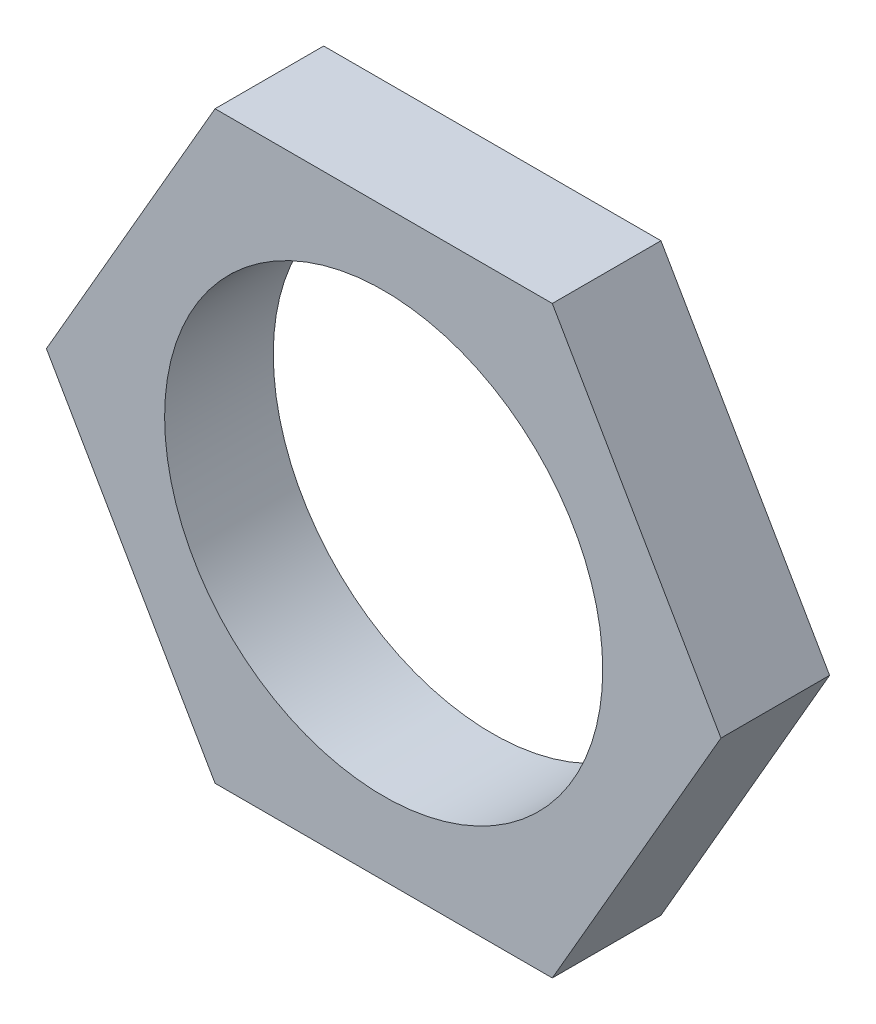
ISO-10303-21;
HEADER;
FILE_DESCRIPTION(('STEP AP214'),'2;1');
FILE_NAME('part.step','',(''),(''),'','','');
FILE_SCHEMA(('AUTOMOTIVE_DESIGN { 1 0 10303 214 1 1 1 1 }'));
ENDSEC;
DATA;
#1=APPLICATION_CONTEXT('core data for automotive mechanical design processes');
#2=APPLICATION_PROTOCOL_DEFINITION('international standard','automotive_design',2000,#1);
#3=PRODUCT_CONTEXT('',#1,'mechanical');
#4=PRODUCT('Part','Part','',(#3));
#5=PRODUCT_RELATED_PRODUCT_CATEGORY('part','',(#4));
#6=PRODUCT_DEFINITION_FORMATION('','',#4);
#7=PRODUCT_DEFINITION_CONTEXT('part definition',#1,'design');
#8=PRODUCT_DEFINITION('design','',#6,#7);
#9=PRODUCT_DEFINITION_SHAPE('','',#8);
#10=(LENGTH_UNIT() NAMED_UNIT(*) SI_UNIT(.MILLI.,.METRE.));
#11=(NAMED_UNIT(*) PLANE_ANGLE_UNIT() SI_UNIT($,.RADIAN.));
#12=(NAMED_UNIT(*) SI_UNIT($,.STERADIAN.) SOLID_ANGLE_UNIT());
#13=UNCERTAINTY_MEASURE_WITH_UNIT(LENGTH_MEASURE(1.E-05),#10,'distance_accuracy_value','');
#14=(GEOMETRIC_REPRESENTATION_CONTEXT(3) GLOBAL_UNCERTAINTY_ASSIGNED_CONTEXT((#13)) GLOBAL_UNIT_ASSIGNED_CONTEXT((#10,
#11,#12)) REPRESENTATION_CONTEXT('',''));
#15=CARTESIAN_POINT('',(0.,0.,0.));
#16=DIRECTION('',(0.,0.,1.));
#17=DIRECTION('',(1.,0.,0.));
#18=AXIS2_PLACEMENT_3D('',#15,#16,#17);
#19=CARTESIAN_POINT('',(-51.2087450524918,-9.71309050598041,2.3622));
#20=DIRECTION('',(0.,1.,0.));
#21=DIRECTION('',(-1.,0.,0.));
#22=AXIS2_PLACEMENT_3D('',#19,#20,#21);
#23=PLANE('',#22);
#24=DIRECTION('',(1.,0.,0.));
#25=VECTOR('',#24,1.);
#26=CARTESIAN_POINT('',(-51.2087450524918,-9.71309050598041,0.));
#27=LINE('',#26,#25);
#28=CARTESIAN_POINT('',(-58.5410934712003,-9.71309050598041,0.));
#29=VERTEX_POINT('',#28);
#30=CARTESIAN_POINT('',(-51.2087450524918,-9.71309050598041,0.));
#31=VERTEX_POINT('',#30);
#32=EDGE_CURVE('E117',#29,#31,#27,.T.);
#33=ORIENTED_EDGE('',*,*,#32,.T.);
#34=DIRECTION('',(0.,0.,-1.));
#35=VECTOR('',#34,1.);
#36=CARTESIAN_POINT('',(-51.2087450524918,-9.71309050598041,2.3622));
#37=LINE('',#36,#35);
#38=CARTESIAN_POINT('',(-51.2087450524918,-9.71309050598041,2.3622));
#39=VERTEX_POINT('',#38);
#40=EDGE_CURVE('E11',#39,#31,#37,.T.);
#41=ORIENTED_EDGE('',*,*,#40,.F.);
#42=DIRECTION('',(1.,0.,0.));
#43=VECTOR('',#42,1.);
#44=CARTESIAN_POINT('',(-51.2087450524918,-9.71309050598041,2.3622));
#45=LINE('',#44,#43);
#46=CARTESIAN_POINT('',(-58.5410934712003,-9.71309050598041,2.3622));
#47=VERTEX_POINT('',#46);
#48=EDGE_CURVE('E128',#47,#39,#45,.T.);
#49=ORIENTED_EDGE('',*,*,#48,.F.);
#50=DIRECTION('',(0.,0.,-1.));
#51=VECTOR('',#50,1.);
#52=CARTESIAN_POINT('',(-58.5410934712003,-9.71309050598041,2.3622));
#53=LINE('',#52,#51);
#54=EDGE_CURVE('E113',#47,#29,#53,.T.);
#55=ORIENTED_EDGE('',*,*,#54,.T.);
#56=EDGE_LOOP('',(#33,#41,#49,#55));
#57=FACE_BOUND('',#56,.T.);
#58=ADVANCED_FACE('F33',(#57),#23,.F.);
#59=CARTESIAN_POINT('',(-47.5425708431376,-3.36309050598026,2.3622));
#60=DIRECTION('',(-0.866025403784439,0.5,0.));
#61=DIRECTION('',(-0.5,-0.866025403784439,0.));
#62=AXIS2_PLACEMENT_3D('',#59,#60,#61);
#63=PLANE('',#62);
#64=DIRECTION('',(0.5,0.866025403784439,0.));
#65=VECTOR('',#64,1.);
#66=CARTESIAN_POINT('',(-47.5425708431376,-3.36309050598026,0.));
#67=LINE('',#66,#65);
#68=CARTESIAN_POINT('',(-47.5425708431376,-3.36309050598026,0.));
#69=VERTEX_POINT('',#68);
#70=EDGE_CURVE('E120',#31,#69,#67,.T.);
#71=ORIENTED_EDGE('',*,*,#70,.T.);
#72=DIRECTION('',(0.,0.,-1.));
#73=VECTOR('',#72,1.);
#74=CARTESIAN_POINT('',(-47.5425708431376,-3.36309050598026,2.3622));
#75=LINE('',#74,#73);
#76=CARTESIAN_POINT('',(-47.5425708431376,-3.36309050598026,2.3622));
#77=VERTEX_POINT('',#76);
#78=EDGE_CURVE('E41',#77,#69,#75,.T.);
#79=ORIENTED_EDGE('',*,*,#78,.F.);
#80=DIRECTION('',(0.5,0.866025403784439,0.));
#81=VECTOR('',#80,1.);
#82=CARTESIAN_POINT('',(-47.5425708431376,-3.36309050598026,2.3622));
#83=LINE('',#82,#81);
#84=EDGE_CURVE('E86',#39,#77,#83,.T.);
#85=ORIENTED_EDGE('',*,*,#84,.F.);
#86=ORIENTED_EDGE('',*,*,#40,.T.);
#87=EDGE_LOOP('',(#71,#79,#85,#86));
#88=FACE_BOUND('',#87,.T.);
#89=ADVANCED_FACE('F153',(#88),#63,.F.);
#90=CARTESIAN_POINT('',(-51.2087450524918,2.9869094940199,2.3622));
#91=DIRECTION('',(-0.866025403784439,-0.5,0.));
#92=DIRECTION('',(0.5,-0.866025403784439,0.));
#93=AXIS2_PLACEMENT_3D('',#90,#91,#92);
#94=PLANE('',#93);
#95=DIRECTION('',(-0.5,0.866025403784439,0.));
#96=VECTOR('',#95,1.);
#97=CARTESIAN_POINT('',(-51.2087450524918,2.9869094940199,0.));
#98=LINE('',#97,#96);
#99=CARTESIAN_POINT('',(-51.2087450524918,2.9869094940199,0.));
#100=VERTEX_POINT('',#99);
#101=EDGE_CURVE('E123',#69,#100,#98,.T.);
#102=ORIENTED_EDGE('',*,*,#101,.T.);
#103=DIRECTION('',(0.,0.,-1.));
#104=VECTOR('',#103,1.);
#105=CARTESIAN_POINT('',(-51.2087450524918,2.9869094940199,2.3622));
#106=LINE('',#105,#104);
#107=CARTESIAN_POINT('',(-51.2087450524918,2.9869094940199,2.3622));
#108=VERTEX_POINT('',#107);
#109=EDGE_CURVE('E108',#108,#100,#106,.T.);
#110=ORIENTED_EDGE('',*,*,#109,.F.);
#111=DIRECTION('',(-0.5,0.866025403784439,0.));
#112=VECTOR('',#111,1.);
#113=CARTESIAN_POINT('',(-51.2087450524918,2.9869094940199,2.3622));
#114=LINE('',#113,#112);
#115=EDGE_CURVE('E99',#77,#108,#114,.T.);
#116=ORIENTED_EDGE('',*,*,#115,.F.);
#117=ORIENTED_EDGE('',*,*,#78,.T.);
#118=EDGE_LOOP('',(#102,#110,#116,#117));
#119=FACE_BOUND('',#118,.T.);
#120=ADVANCED_FACE('F134',(#119),#94,.F.);
#121=CARTESIAN_POINT('',(-58.5410934712003,2.9869094940199,2.3622));
#122=DIRECTION('',(0.,-1.,0.));
#123=DIRECTION('',(0.,0.,-1.));
#124=AXIS2_PLACEMENT_3D('',#121,#122,#123);
#125=PLANE('',#124);
#126=DIRECTION('',(-1.,0.,0.));
#127=VECTOR('',#126,1.);
#128=CARTESIAN_POINT('',(-58.5410934712003,2.9869094940199,0.));
#129=LINE('',#128,#127);
#130=CARTESIAN_POINT('',(-58.5410934712003,2.9869094940199,0.));
#131=VERTEX_POINT('',#130);
#132=EDGE_CURVE('E107',#100,#131,#129,.T.);
#133=ORIENTED_EDGE('',*,*,#132,.T.);
#134=DIRECTION('',(0.,0.,-1.));
#135=VECTOR('',#134,1.);
#136=CARTESIAN_POINT('',(-58.5410934712003,2.9869094940199,2.3622));
#137=LINE('',#136,#135);
#138=CARTESIAN_POINT('',(-58.5410934712003,2.9869094940199,2.3622));
#139=VERTEX_POINT('',#138);
#140=EDGE_CURVE('E104',#139,#131,#137,.T.);
#141=ORIENTED_EDGE('',*,*,#140,.F.);
#142=DIRECTION('',(-1.,0.,0.));
#143=VECTOR('',#142,1.);
#144=CARTESIAN_POINT('',(-58.5410934712003,2.9869094940199,2.3622));
#145=LINE('',#144,#143);
#146=EDGE_CURVE('E93',#108,#139,#145,.T.);
#147=ORIENTED_EDGE('',*,*,#146,.F.);
#148=ORIENTED_EDGE('',*,*,#109,.T.);
#149=EDGE_LOOP('',(#133,#141,#147,#148));
#150=FACE_BOUND('',#149,.T.);
#151=ADVANCED_FACE('F105',(#150),#125,.F.);
#152=CARTESIAN_POINT('',(-62.2072676805545,-3.36309050598026,2.3622));
#153=DIRECTION('',(0.866025403784439,-0.5,0.));
#154=DIRECTION('',(0.5,0.866025403784439,0.));
#155=AXIS2_PLACEMENT_3D('',#152,#153,#154);
#156=PLANE('',#155);
#157=DIRECTION('',(-0.5,-0.866025403784439,0.));
#158=VECTOR('',#157,1.);
#159=CARTESIAN_POINT('',(-62.2072676805545,-3.36309050598026,0.));
#160=LINE('',#159,#158);
#161=CARTESIAN_POINT('',(-62.2072676805545,-3.36309050598026,0.));
#162=VERTEX_POINT('',#161);
#163=EDGE_CURVE('E72',#131,#162,#160,.T.);
#164=ORIENTED_EDGE('',*,*,#163,.T.);
#165=DIRECTION('',(0.,0.,-1.));
#166=VECTOR('',#165,1.);
#167=CARTESIAN_POINT('',(-62.2072676805545,-3.36309050598026,2.3622));
#168=LINE('',#167,#166);
#169=CARTESIAN_POINT('',(-62.2072676805545,-3.36309050598026,2.3622));
#170=VERTEX_POINT('',#169);
#171=EDGE_CURVE('E109',#170,#162,#168,.T.);
#172=ORIENTED_EDGE('',*,*,#171,.F.);
#173=DIRECTION('',(-0.5,-0.866025403784439,0.));
#174=VECTOR('',#173,1.);
#175=CARTESIAN_POINT('',(-62.2072676805545,-3.36309050598026,2.3622));
#176=LINE('',#175,#174);
#177=EDGE_CURVE('E97',#139,#170,#176,.T.);
#178=ORIENTED_EDGE('',*,*,#177,.F.);
#179=ORIENTED_EDGE('',*,*,#140,.T.);
#180=EDGE_LOOP('',(#164,#172,#178,#179));
#181=FACE_BOUND('',#180,.T.);
#182=ADVANCED_FACE('F111',(#181),#156,.F.);
#183=CARTESIAN_POINT('',(-58.5410934712003,-9.71309050598041,2.3622));
#184=DIRECTION('',(0.866025403784439,0.5,0.));
#185=DIRECTION('',(-0.5,0.866025403784439,0.));
#186=AXIS2_PLACEMENT_3D('',#183,#184,#185);
#187=PLANE('',#186);
#188=DIRECTION('',(0.5,-0.866025403784439,0.));
#189=VECTOR('',#188,1.);
#190=CARTESIAN_POINT('',(-58.5410934712003,-9.71309050598041,0.));
#191=LINE('',#190,#189);
#192=EDGE_CURVE('E78',#162,#29,#191,.T.);
#193=ORIENTED_EDGE('',*,*,#192,.T.);
#194=ORIENTED_EDGE('',*,*,#54,.F.);
#195=DIRECTION('',(0.5,-0.866025403784439,0.));
#196=VECTOR('',#195,1.);
#197=CARTESIAN_POINT('',(-58.5410934712003,-9.71309050598041,2.3622));
#198=LINE('',#197,#196);
#199=EDGE_CURVE('E49',#170,#47,#198,.T.);
#200=ORIENTED_EDGE('',*,*,#199,.F.);
#201=ORIENTED_EDGE('',*,*,#171,.T.);
#202=EDGE_LOOP('',(#193,#194,#200,#201));
#203=FACE_BOUND('',#202,.T.);
#204=ADVANCED_FACE('F141',(#203),#187,.F.);
#205=CARTESIAN_POINT('',(0.,0.,2.3622));
#206=DIRECTION('',(0.,0.,-1.));
#207=DIRECTION('',(-1.,0.,0.));
#208=AXIS2_PLACEMENT_3D('',#205,#206,#207);
#209=PLANE('',#208);
#210=CARTESIAN_POINT('',(-54.874919261846,-3.36309050598025,2.3622));
#211=DIRECTION('',(0.,0.,1.));
#212=DIRECTION('',(1.,0.,0.));
#213=AXIS2_PLACEMENT_3D('',#210,#211,#212);
#214=CIRCLE('',#213,4.7625);
#215=CARTESIAN_POINT('',(-50.112419261846,-3.36309050598025,2.3622));
#216=VERTEX_POINT('',#215);
#217=EDGE_CURVE('E208',#216,#216,#214,.T.);
#218=ORIENTED_EDGE('',*,*,#217,.F.);
#219=EDGE_LOOP('',(#218));
#220=FACE_BOUND('',#219,.T.);
#221=ORIENTED_EDGE('',*,*,#48,.T.);
#222=ORIENTED_EDGE('',*,*,#84,.T.);
#223=ORIENTED_EDGE('',*,*,#115,.T.);
#224=ORIENTED_EDGE('',*,*,#146,.T.);
#225=ORIENTED_EDGE('',*,*,#177,.T.);
#226=ORIENTED_EDGE('',*,*,#199,.T.);
#227=EDGE_LOOP('',(#221,#222,#223,#224,#225,#226));
#228=FACE_BOUND('',#227,.T.);
#229=ADVANCED_FACE('F95',(#220,#228),#209,.F.);
#230=CARTESIAN_POINT('',(0.,0.,0.));
#231=DIRECTION('',(0.,0.,-1.));
#232=DIRECTION('',(-1.,0.,0.));
#233=AXIS2_PLACEMENT_3D('',#230,#231,#232);
#234=PLANE('',#233);
#235=CARTESIAN_POINT('',(-54.874919261846,-3.36309050598025,0.));
#236=DIRECTION('',(0.,0.,1.));
#237=DIRECTION('',(1.,0.,0.));
#238=AXIS2_PLACEMENT_3D('',#235,#236,#237);
#239=CIRCLE('',#238,4.7625);
#240=CARTESIAN_POINT('',(-50.112419261846,-3.36309050598025,0.));
#241=VERTEX_POINT('',#240);
#242=EDGE_CURVE('E121',#241,#241,#239,.T.);
#243=ORIENTED_EDGE('',*,*,#242,.T.);
#244=EDGE_LOOP('',(#243));
#245=FACE_BOUND('',#244,.T.);
#246=ORIENTED_EDGE('',*,*,#32,.F.);
#247=ORIENTED_EDGE('',*,*,#192,.F.);
#248=ORIENTED_EDGE('',*,*,#163,.F.);
#249=ORIENTED_EDGE('',*,*,#132,.F.);
#250=ORIENTED_EDGE('',*,*,#101,.F.);
#251=ORIENTED_EDGE('',*,*,#70,.F.);
#252=EDGE_LOOP('',(#246,#247,#248,#249,#250,#251));
#253=FACE_BOUND('',#252,.T.);
#254=ADVANCED_FACE('F137',(#245,#253),#234,.T.);
#255=CARTESIAN_POINT('',(-54.874919261846,-3.36309050598025,0.));
#256=DIRECTION('',(0.,0.,1.));
#257=DIRECTION('',(1.,0.,0.));
#258=AXIS2_PLACEMENT_3D('',#255,#256,#257);
#259=CYLINDRICAL_SURFACE('',#258,4.7625);
#260=ORIENTED_EDGE('',*,*,#242,.F.);
#261=EDGE_LOOP('',(#260));
#262=FACE_BOUND('',#261,.T.);
#263=ORIENTED_EDGE('',*,*,#217,.T.);
#264=EDGE_LOOP('',(#263));
#265=FACE_BOUND('',#264,.T.);
#266=ADVANCED_FACE('F190',(#262,#265),#259,.F.);
#267=CLOSED_SHELL('',(#58,#89,#120,#151,#182,#204,#229,#254,#266));
#268=MANIFOLD_SOLID_BREP('B2',#267);
#269=ADVANCED_BREP_SHAPE_REPRESENTATION('',(#18,#268),#14);
#270=SHAPE_DEFINITION_REPRESENTATION(#9,#269);
ENDSEC;
END-ISO-10303-21;
